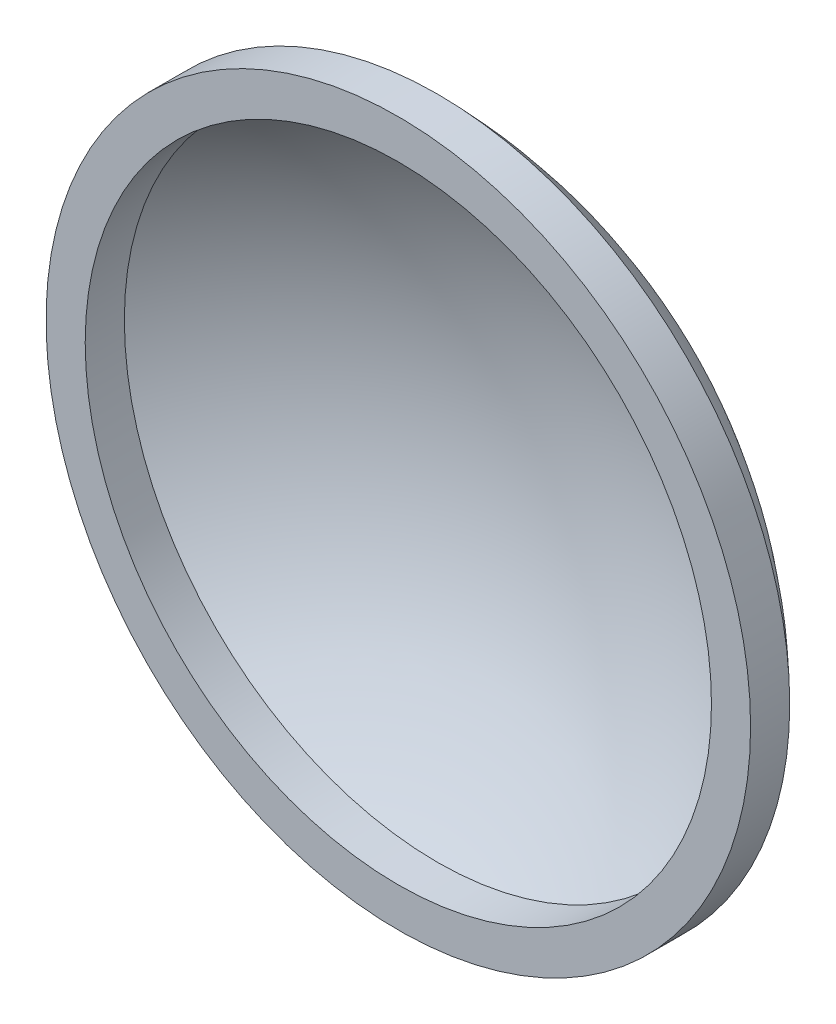
ISO-10303-21;
HEADER;
FILE_DESCRIPTION(('STEP AP214'),'2;1');
FILE_NAME('part.step','',(''),(''),'','','');
FILE_SCHEMA(('AUTOMOTIVE_DESIGN { 1 0 10303 214 1 1 1 1 }'));
ENDSEC;
DATA;
#1=APPLICATION_CONTEXT('core data for automotive mechanical design processes');
#2=APPLICATION_PROTOCOL_DEFINITION('international standard','automotive_design',2000,#1);
#3=PRODUCT_CONTEXT('',#1,'mechanical');
#4=PRODUCT('Part','Part','',(#3));
#5=PRODUCT_RELATED_PRODUCT_CATEGORY('part','',(#4));
#6=PRODUCT_DEFINITION_FORMATION('','',#4);
#7=PRODUCT_DEFINITION_CONTEXT('part definition',#1,'design');
#8=PRODUCT_DEFINITION('design','',#6,#7);
#9=PRODUCT_DEFINITION_SHAPE('','',#8);
#10=(LENGTH_UNIT() NAMED_UNIT(*) SI_UNIT(.MILLI.,.METRE.));
#11=(NAMED_UNIT(*) PLANE_ANGLE_UNIT() SI_UNIT($,.RADIAN.));
#12=(NAMED_UNIT(*) SI_UNIT($,.STERADIAN.) SOLID_ANGLE_UNIT());
#13=UNCERTAINTY_MEASURE_WITH_UNIT(LENGTH_MEASURE(1.E-05),#10,'distance_accuracy_value','');
#14=(GEOMETRIC_REPRESENTATION_CONTEXT(3) GLOBAL_UNCERTAINTY_ASSIGNED_CONTEXT((#13)) GLOBAL_UNIT_ASSIGNED_CONTEXT((#10,
#11,#12)) REPRESENTATION_CONTEXT('',''));
#15=CARTESIAN_POINT('',(0.,0.,0.));
#16=DIRECTION('',(0.,0.,1.));
#17=DIRECTION('',(1.,0.,0.));
#18=AXIS2_PLACEMENT_3D('',#15,#16,#17);
#19=CARTESIAN_POINT('',(0.,0.,0.));
#20=DIRECTION('',(0.,0.,1.));
#21=DIRECTION('',(1.,0.,0.));
#22=AXIS2_PLACEMENT_3D('',#19,#20,#21);
#23=CYLINDRICAL_SURFACE('',#22,40.);
#24=CARTESIAN_POINT('',(0.,0.,-4.99999999999999));
#25=DIRECTION('',(0.,0.,1.));
#26=DIRECTION('',(1.,0.,0.));
#27=AXIS2_PLACEMENT_3D('',#24,#25,#26);
#28=CIRCLE('',#27,40.);
#29=CARTESIAN_POINT('',(40.,0.,-4.99999999999999));
#30=VERTEX_POINT('',#29);
#31=EDGE_CURVE('E45',#30,#30,#28,.T.);
#32=ORIENTED_EDGE('',*,*,#31,.F.);
#33=EDGE_LOOP('',(#32));
#34=FACE_BOUND('',#33,.T.);
#35=CARTESIAN_POINT('',(0.,0.,0.));
#36=DIRECTION('',(0.,0.,1.));
#37=DIRECTION('',(1.,0.,0.));
#38=AXIS2_PLACEMENT_3D('',#35,#36,#37);
#39=CIRCLE('',#38,40.);
#40=CARTESIAN_POINT('',(40.,0.,0.));
#41=VERTEX_POINT('',#40);
#42=EDGE_CURVE('E10',#41,#41,#39,.T.);
#43=ORIENTED_EDGE('',*,*,#42,.T.);
#44=EDGE_LOOP('',(#43));
#45=FACE_BOUND('',#44,.T.);
#46=ADVANCED_FACE('F31',(#34,#45),#23,.F.);
#47=CARTESIAN_POINT('',(0.,45.,0.));
#48=DIRECTION('',(0.,0.,-1.));
#49=DIRECTION('',(-1.,0.,0.));
#50=AXIS2_PLACEMENT_3D('',#47,#48,#49);
#51=PLANE('',#50);
#52=ORIENTED_EDGE('',*,*,#42,.F.);
#53=EDGE_LOOP('',(#52));
#54=FACE_BOUND('',#53,.T.);
#55=CARTESIAN_POINT('',(0.,0.,0.));
#56=DIRECTION('',(0.,0.,1.));
#57=DIRECTION('',(1.,0.,0.));
#58=AXIS2_PLACEMENT_3D('',#55,#56,#57);
#59=CIRCLE('',#58,45.);
#60=CARTESIAN_POINT('',(45.,0.,0.));
#61=VERTEX_POINT('',#60);
#62=EDGE_CURVE('E37',#61,#61,#59,.T.);
#63=ORIENTED_EDGE('',*,*,#62,.T.);
#64=EDGE_LOOP('',(#63));
#65=FACE_BOUND('',#64,.T.);
#66=ADVANCED_FACE('F54',(#54,#65),#51,.F.);
#67=CARTESIAN_POINT('',(0.,0.,0.));
#68=DIRECTION('',(0.,0.,1.));
#69=DIRECTION('',(1.,0.,0.));
#70=AXIS2_PLACEMENT_3D('',#67,#68,#69);
#71=CYLINDRICAL_SURFACE('',#70,45.);
#72=ORIENTED_EDGE('',*,*,#62,.F.);
#73=EDGE_LOOP('',(#72));
#74=FACE_BOUND('',#73,.T.);
#75=CARTESIAN_POINT('',(0.,0.,-5.));
#76=DIRECTION('',(0.,0.,1.));
#77=DIRECTION('',(1.,0.,0.));
#78=AXIS2_PLACEMENT_3D('',#75,#76,#77);
#79=CIRCLE('',#78,45.);
#80=CARTESIAN_POINT('',(45.,0.,-5.));
#81=VERTEX_POINT('',#80);
#82=EDGE_CURVE('E41',#81,#81,#79,.T.);
#83=ORIENTED_EDGE('',*,*,#82,.T.);
#84=EDGE_LOOP('',(#83));
#85=FACE_BOUND('',#84,.T.);
#86=ADVANCED_FACE('F58',(#74,#85),#71,.T.);
#87=CARTESIAN_POINT('',(0.,0.,40.8333333333333));
#88=DIRECTION('',(0.,0.,1.));
#89=DIRECTION('',(0.,1.,0.));
#90=AXIS2_PLACEMENT_3D('',#87,#88,#89);
#91=SPHERICAL_SURFACE('',#90,64.2315689084771);
#92=ORIENTED_EDGE('',*,*,#82,.F.);
#93=EDGE_LOOP('',(#92));
#94=FACE_BOUND('',#93,.T.);
#95=ADVANCED_FACE('F63',(#94),#91,.T.);
#96=CARTESIAN_POINT('',(0.,0.,40.8333333333333));
#97=DIRECTION('',(0.,0.,1.));
#98=DIRECTION('',(0.,1.,0.));
#99=AXIS2_PLACEMENT_3D('',#96,#97,#98);
#100=SPHERICAL_SURFACE('',#99,60.8333333333333);
#101=ORIENTED_EDGE('',*,*,#31,.T.);
#102=EDGE_LOOP('',(#101));
#103=FACE_BOUND('',#102,.T.);
#104=ADVANCED_FACE('F51',(#103),#100,.F.);
#105=CLOSED_SHELL('',(#46,#66,#86,#95,#104));
#106=MANIFOLD_SOLID_BREP('B2',#105);
#107=ADVANCED_BREP_SHAPE_REPRESENTATION('',(#18,#106),#14);
#108=SHAPE_DEFINITION_REPRESENTATION(#9,#107);
ENDSEC;
END-ISO-10303-21;
